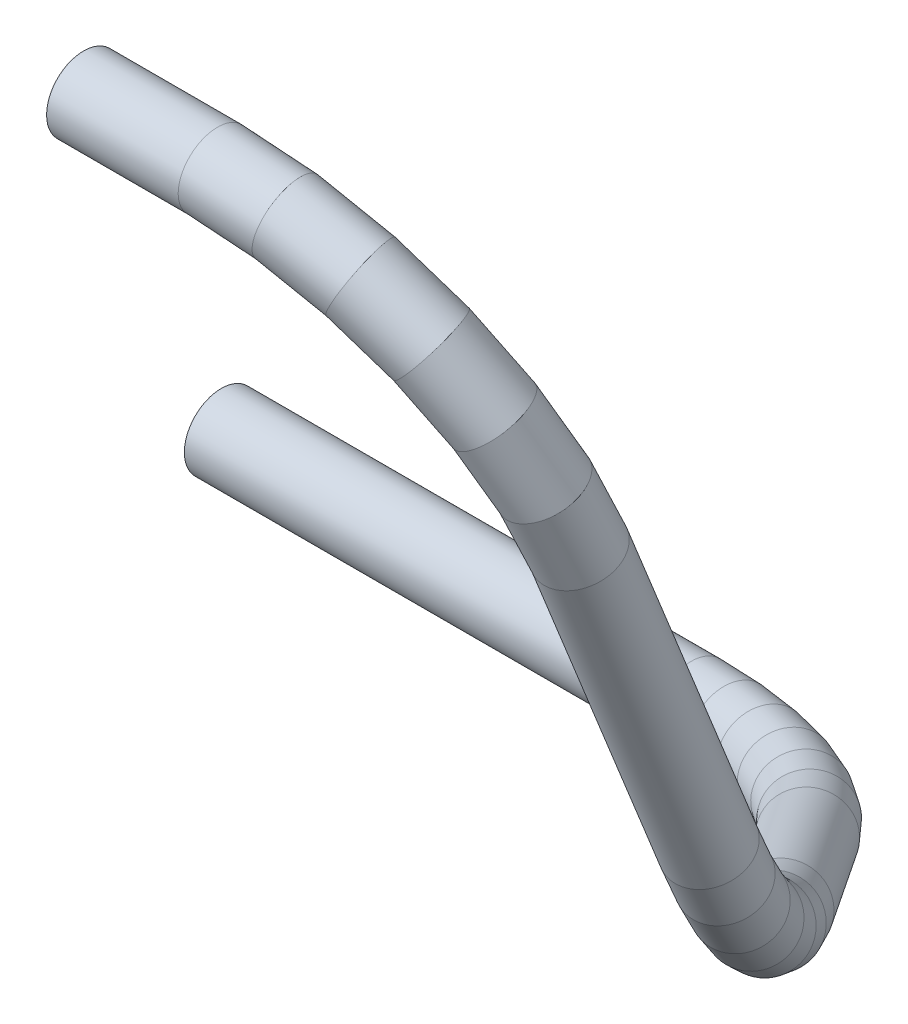
ISO-10303-21;
HEADER;
FILE_DESCRIPTION(('STEP AP214'),'2;1');
FILE_NAME('part.step','',(''),(''),'','','');
FILE_SCHEMA(('AUTOMOTIVE_DESIGN { 1 0 10303 214 1 1 1 1 }'));
ENDSEC;
DATA;
#1=APPLICATION_CONTEXT('core data for automotive mechanical design processes');
#2=APPLICATION_PROTOCOL_DEFINITION('international standard','automotive_design',2000,#1);
#3=PRODUCT_CONTEXT('',#1,'mechanical');
#4=PRODUCT('Part','Part','',(#3));
#5=PRODUCT_RELATED_PRODUCT_CATEGORY('part','',(#4));
#6=PRODUCT_DEFINITION_FORMATION('','',#4);
#7=PRODUCT_DEFINITION_CONTEXT('part definition',#1,'design');
#8=PRODUCT_DEFINITION('design','',#6,#7);
#9=PRODUCT_DEFINITION_SHAPE('','',#8);
#10=(LENGTH_UNIT() NAMED_UNIT(*) SI_UNIT(.MILLI.,.METRE.));
#11=(NAMED_UNIT(*) PLANE_ANGLE_UNIT() SI_UNIT($,.RADIAN.));
#12=(NAMED_UNIT(*) SI_UNIT($,.STERADIAN.) SOLID_ANGLE_UNIT());
#13=UNCERTAINTY_MEASURE_WITH_UNIT(LENGTH_MEASURE(1.E-05),#10,'distance_accuracy_value','');
#14=(GEOMETRIC_REPRESENTATION_CONTEXT(3) GLOBAL_UNCERTAINTY_ASSIGNED_CONTEXT((#13)) GLOBAL_UNIT_ASSIGNED_CONTEXT((#10,
#11,#12)) REPRESENTATION_CONTEXT('',''));
#15=CARTESIAN_POINT('',(0.,0.,0.));
#16=DIRECTION('',(0.,0.,1.));
#17=DIRECTION('',(1.,0.,0.));
#18=AXIS2_PLACEMENT_3D('',#15,#16,#17);
#19=CARTESIAN_POINT('',(-530.,11.7,-66.9));
#20=DIRECTION('',(-1.,0.,0.));
#21=DIRECTION('',(0.,0.,1.));
#22=AXIS2_PLACEMENT_3D('',#19,#20,#21);
#23=CYLINDRICAL_SURFACE('',#22,1.);
#24=CARTESIAN_POINT('',(-530.,11.7,-66.9));
#25=DIRECTION('',(-0.997858923238604,0.0606787237936054,0.0244061834762019));
#26=DIRECTION('',(0.0654031292301423,0.925778425297038,0.372366402809709));
#27=AXIS2_PLACEMENT_3D('',#24,#25,#26);
#28=ELLIPSE('',#27,1.0021456708073,1.);
#29=CARTESIAN_POINT('',(-529.934456537185,12.6277648410382,-66.5268346214702));
#30=VERTEX_POINT('',#29);
#31=EDGE_CURVE('E77',#30,#30,#28,.T.);
#32=ORIENTED_EDGE('',*,*,#31,.F.);
#33=EDGE_LOOP('',(#32));
#34=FACE_BOUND('',#33,.T.);
#35=CARTESIAN_POINT('',(-538.85,11.7,-66.9));
#36=DIRECTION('',(-1.,0.,0.));
#37=DIRECTION('',(0.,0.,1.));
#38=AXIS2_PLACEMENT_3D('',#35,#36,#37);
#39=CIRCLE('',#38,1.);
#40=CARTESIAN_POINT('',(-538.85,11.7,-65.9));
#41=VERTEX_POINT('',#40);
#42=EDGE_CURVE('E11',#41,#41,#39,.F.);
#43=ORIENTED_EDGE('',*,*,#42,.F.);
#44=EDGE_LOOP('',(#43));
#45=FACE_BOUND('',#44,.T.);
#46=ADVANCED_FACE('F58',(#34,#45),#23,.F.);
#47=CARTESIAN_POINT('',(-530.,11.7,-66.9));
#48=DIRECTION('',(-1.,0.,0.));
#49=DIRECTION('',(0.,0.,1.));
#50=AXIS2_PLACEMENT_3D('',#47,#48,#49);
#51=CYLINDRICAL_SURFACE('',#50,2.5);
#52=CARTESIAN_POINT('',(-530.,11.7,-66.9));
#53=DIRECTION('',(-0.997858923238604,0.0606787237936054,0.0244061834762019));
#54=DIRECTION('',(0.0654031292301423,0.925778425297038,0.372366402809709));
#55=AXIS2_PLACEMENT_3D('',#52,#53,#54);
#56=ELLIPSE('',#55,2.50536417701825,2.5);
#57=CARTESIAN_POINT('',(-529.836141342962,14.0194121025956,-65.9670865536754));
#58=VERTEX_POINT('',#57);
#59=EDGE_CURVE('E75',#58,#58,#56,.T.);
#60=ORIENTED_EDGE('',*,*,#59,.T.);
#61=EDGE_LOOP('',(#60));
#62=FACE_BOUND('',#61,.T.);
#63=CARTESIAN_POINT('',(-538.85,11.7,-66.9));
#64=DIRECTION('',(-1.,0.,0.));
#65=DIRECTION('',(0.,0.,1.));
#66=AXIS2_PLACEMENT_3D('',#63,#64,#65);
#67=CIRCLE('',#66,2.5);
#68=CARTESIAN_POINT('',(-538.85,11.7,-64.4));
#69=VERTEX_POINT('',#68);
#70=EDGE_CURVE('E61',#69,#69,#67,.F.);
#71=ORIENTED_EDGE('',*,*,#70,.T.);
#72=EDGE_LOOP('',(#71));
#73=FACE_BOUND('',#72,.T.);
#74=ADVANCED_FACE('F65',(#62,#73),#51,.T.);
#75=CARTESIAN_POINT('',(-525.341257188155,11.1309692335842,-67.1288754347568));
#76=DIRECTION('',(-0.991444861373811,0.12109761197636,0.0487078559278532));
#77=DIRECTION('',(-0.121241517415333,-0.992623037439101,0.));
#78=AXIS2_PLACEMENT_3D('',#75,#76,#77);
#79=CYLINDRICAL_SURFACE('',#78,2.5);
#80=CARTESIAN_POINT('',(-525.341257188155,11.1309692335842,-67.1288754347568));
#81=DIRECTION('',(-0.965925826289068,0.240123210237206,0.0965823069364155));
#82=DIRECTION('',(0.258819045102522,0.896152020681788,0.36045007659892));
#83=AXIS2_PLACEMENT_3D('',#80,#81,#82);
#84=ELLIPSE('',#83,2.52157240145038,2.5);
#85=CARTESIAN_POINT('',(-524.688626227054,13.3906814364394,-66.2199744695043));
#86=VERTEX_POINT('',#85);
#87=EDGE_CURVE('E78',#86,#86,#84,.F.);
#88=ORIENTED_EDGE('',*,*,#87,.F.);
#89=EDGE_LOOP('',(#88));
#90=FACE_BOUND('',#89,.T.);
#91=ORIENTED_EDGE('',*,*,#59,.F.);
#92=EDGE_LOOP('',(#91));
#93=FACE_BOUND('',#92,.T.);
#94=ADVANCED_FACE('F215',(#90,#93),#79,.T.);
#95=CARTESIAN_POINT('',(-525.341257188155,11.1309692335842,-67.1288754347568));
#96=DIRECTION('',(-0.991444861373811,0.12109761197636,0.0487078559278532));
#97=DIRECTION('',(-0.121241517415333,-0.992623037439101,0.));
#98=AXIS2_PLACEMENT_3D('',#95,#96,#97);
#99=CYLINDRICAL_SURFACE('',#98,1.);
#100=CARTESIAN_POINT('',(-525.341257188155,11.1309692335842,-67.1288754347568));
#101=DIRECTION('',(-0.965925826289068,0.240123210237206,0.0965823069364155));
#102=DIRECTION('',(0.258819045102522,0.896152020681788,0.36045007659892));
#103=AXIS2_PLACEMENT_3D('',#100,#101,#102);
#104=ELLIPSE('',#103,1.00862896058015,1.);
#105=CARTESIAN_POINT('',(-525.080204803715,12.0348541147263,-66.7653150486558));
#106=VERTEX_POINT('',#105);
#107=EDGE_CURVE('E80',#106,#106,#104,.F.);
#108=ORIENTED_EDGE('',*,*,#107,.T.);
#109=EDGE_LOOP('',(#108));
#110=FACE_BOUND('',#109,.T.);
#111=ORIENTED_EDGE('',*,*,#31,.T.);
#112=EDGE_LOOP('',(#111));
#113=FACE_BOUND('',#112,.T.);
#114=ADVANCED_FACE('F202',(#110,#113),#99,.F.);
#115=CARTESIAN_POINT('',(-521.,9.46265544070036,-67.7999042563829));
#116=DIRECTION('',(-0.923879532511285,0.355040233796162,0.142804207895621));
#117=DIRECTION('',(-0.358716736816524,-0.933446464842899,0.));
#118=AXIS2_PLACEMENT_3D('',#115,#116,#117);
#119=CYLINDRICAL_SURFACE('',#118,1.);
#120=CARTESIAN_POINT('',(-521.,9.46265544070036,-67.7999042563829));
#121=DIRECTION('',(-0.866025403784438,0.463882420519113,0.186582689264922));
#122=DIRECTION('',(0.500000000000002,0.803467921077137,0.323170697619667));
#123=AXIS2_PLACEMENT_3D('',#120,#121,#122);
#124=ELLIPSE('',#123,1.00862896058015,1.);
#125=CARTESIAN_POINT('',(-520.49568551971,10.2730564547959,-67.4739449315529));
#126=VERTEX_POINT('',#125);
#127=EDGE_CURVE('E81',#126,#126,#124,.T.);
#128=ORIENTED_EDGE('',*,*,#127,.F.);
#129=EDGE_LOOP('',(#128));
#130=FACE_BOUND('',#129,.T.);
#131=ORIENTED_EDGE('',*,*,#107,.F.);
#132=EDGE_LOOP('',(#131));
#133=FACE_BOUND('',#132,.T.);
#134=ADVANCED_FACE('F220',(#130,#133),#119,.F.);
#135=CARTESIAN_POINT('',(-521.,9.46265544070036,-67.7999042563829));
#136=DIRECTION('',(-0.923879532511285,0.355040233796162,0.142804207895621));
#137=DIRECTION('',(-0.358716736816524,-0.933446464842899,0.));
#138=AXIS2_PLACEMENT_3D('',#135,#136,#137);
#139=CYLINDRICAL_SURFACE('',#138,2.5);
#140=CARTESIAN_POINT('',(-521.,9.46265544070036,-67.7999042563829));
#141=DIRECTION('',(-0.866025403784438,0.463882420519113,0.186582689264922));
#142=DIRECTION('',(0.500000000000002,0.803467921077137,0.323170697619667));
#143=AXIS2_PLACEMENT_3D('',#140,#141,#142);
#144=ELLIPSE('',#143,2.52157240145038,2.5);
#145=CARTESIAN_POINT('',(-519.739213799275,11.4886579759392,-66.9850059443077));
#146=VERTEX_POINT('',#145);
#147=EDGE_CURVE('E82',#146,#146,#144,.T.);
#148=ORIENTED_EDGE('',*,*,#147,.T.);
#149=EDGE_LOOP('',(#148));
#150=FACE_BOUND('',#149,.T.);
#151=ORIENTED_EDGE('',*,*,#87,.T.);
#152=EDGE_LOOP('',(#151));
#153=FACE_BOUND('',#152,.T.);
#154=ADVANCED_FACE('F225',(#150,#153),#139,.T.);
#155=CARTESIAN_POINT('',(-517.272077938642,6.80875144931453,-68.8673569596122));
#156=DIRECTION('',(-0.793353340291235,0.564787450414478,0.227168689090405));
#157=DIRECTION('',(-0.579949997240358,-0.814652073403676,0.));
#158=AXIS2_PLACEMENT_3D('',#155,#156,#157);
#159=CYLINDRICAL_SURFACE('',#158,2.5);
#160=CARTESIAN_POINT('',(-517.272077938642,6.80875144931453,-68.8673569596122));
#161=DIRECTION('',(-0.707106781186552,0.656028810444585,0.263867769662492));
#162=DIRECTION('',(0.707106781186544,0.656028810444596,0.263867769662485));
#163=AXIS2_PLACEMENT_3D('',#160,#161,#162);
#164=ELLIPSE('',#163,2.52157240145038,2.5);
#165=CARTESIAN_POINT('',(-515.489056994324,8.46297559228795,-68.201995273999));
#166=VERTEX_POINT('',#165);
#167=EDGE_CURVE('E86',#166,#166,#164,.F.);
#168=ORIENTED_EDGE('',*,*,#167,.F.);
#169=EDGE_LOOP('',(#168));
#170=FACE_BOUND('',#169,.T.);
#171=ORIENTED_EDGE('',*,*,#147,.F.);
#172=EDGE_LOOP('',(#171));
#173=FACE_BOUND('',#172,.T.);
#174=ADVANCED_FACE('F223',(#170,#173),#159,.T.);
#175=CARTESIAN_POINT('',(-517.272077938642,6.80875144931453,-68.8673569596122));
#176=DIRECTION('',(-0.793353340291235,0.564787450414478,0.227168689090405));
#177=DIRECTION('',(-0.579949997240358,-0.814652073403676,0.));
#178=AXIS2_PLACEMENT_3D('',#175,#176,#177);
#179=CYLINDRICAL_SURFACE('',#178,1.);
#180=CARTESIAN_POINT('',(-517.272077938642,6.80875144931453,-68.8673569596122));
#181=DIRECTION('',(-0.707106781186552,0.656028810444585,0.263867769662492));
#182=DIRECTION('',(0.707106781186544,0.656028810444596,0.263867769662485));
#183=AXIS2_PLACEMENT_3D('',#180,#181,#182);
#184=ELLIPSE('',#183,1.00862896058015,1.);
#185=CARTESIAN_POINT('',(-516.558869560915,7.4704411065039,-68.601212285367));
#186=VERTEX_POINT('',#185);
#187=EDGE_CURVE('E83',#186,#186,#184,.F.);
#188=ORIENTED_EDGE('',*,*,#187,.T.);
#189=EDGE_LOOP('',(#188));
#190=FACE_BOUND('',#189,.T.);
#191=ORIENTED_EDGE('',*,*,#127,.T.);
#192=EDGE_LOOP('',(#191));
#193=FACE_BOUND('',#192,.T.);
#194=ADVANCED_FACE('F228',(#190,#193),#179,.F.);
#195=CARTESIAN_POINT('',(-514.41154273188,3.35011643065596,-70.2584884067686));
#196=DIRECTION('',(-0.60876142900873,0.736045335642437,0.296051999537686));
#197=DIRECTION('',(-0.770589455284477,-0.637331853436162,0.));
#198=AXIS2_PLACEMENT_3D('',#195,#196,#197);
#199=CYLINDRICAL_SURFACE('',#198,1.);
#200=CARTESIAN_POINT('',(-514.41154273188,3.35011643065596,-70.2584884067686));
#201=DIRECTION('',(-0.500000000000003,0.803467921077132,0.323170697619676));
#202=DIRECTION('',(0.866025403784437,0.463882420519107,0.186582689264939));
#203=AXIS2_PLACEMENT_3D('',#200,#201,#202);
#204=ELLIPSE('',#203,1.00862896058015,1.);
#205=CARTESIAN_POINT('',(-513.538044429025,3.81800167429556,-70.070295702833));
#206=VERTEX_POINT('',#205);
#207=EDGE_CURVE('E95',#206,#206,#204,.T.);
#208=ORIENTED_EDGE('',*,*,#207,.F.);
#209=EDGE_LOOP('',(#208));
#210=FACE_BOUND('',#209,.T.);
#211=ORIENTED_EDGE('',*,*,#187,.F.);
#212=EDGE_LOOP('',(#211));
#213=FACE_BOUND('',#212,.T.);
#214=ADVANCED_FACE('F234',(#210,#213),#199,.F.);
#215=CARTESIAN_POINT('',(-514.41154273188,3.35011643065596,-70.2584884067686));
#216=DIRECTION('',(-0.60876142900873,0.736045335642437,0.296051999537686));
#217=DIRECTION('',(-0.770589455284477,-0.637331853436162,0.));
#218=AXIS2_PLACEMENT_3D('',#215,#216,#217);
#219=CYLINDRICAL_SURFACE('',#218,2.5);
#220=CARTESIAN_POINT('',(-514.41154273188,3.35011643065596,-70.2584884067686));
#221=DIRECTION('',(-0.500000000000003,0.803467921077132,0.323170697619676));
#222=DIRECTION('',(0.866025403784437,0.463882420519107,0.186582689264939));
#223=AXIS2_PLACEMENT_3D('',#220,#221,#222);
#224=ELLIPSE('',#223,2.52157240145039,2.5);
#225=CARTESIAN_POINT('',(-512.227796974742,4.51982953975495,-69.7880066469297));
#226=VERTEX_POINT('',#225);
#227=EDGE_CURVE('E90',#226,#226,#224,.T.);
#228=ORIENTED_EDGE('',*,*,#227,.T.);
#229=EDGE_LOOP('',(#228));
#230=FACE_BOUND('',#229,.T.);
#231=ORIENTED_EDGE('',*,*,#167,.T.);
#232=EDGE_LOOP('',(#231));
#233=FACE_BOUND('',#232,.T.);
#234=ADVANCED_FACE('F236',(#230,#233),#219,.T.);
#235=CARTESIAN_POINT('',(-512.613335126797,-0.677549354418361,-71.8784952886817));
#236=DIRECTION('',(-0.382683432365086,0.857142947618804,0.344759855465548));
#237=DIRECTION('',(-0.913125854266893,-0.407677782408309,0.));
#238=AXIS2_PLACEMENT_3D('',#235,#236,#237);
#239=CYLINDRICAL_SURFACE('',#238,2.5);
#240=CARTESIAN_POINT('',(-512.613335126797,-0.677549354418361,-71.8784952886817));
#241=DIRECTION('',(-0.258819045102515,0.896152020681794,0.36045007659891));
#242=DIRECTION('',(0.96592582628907,0.240123210237202,0.0965823069364053));
#243=AXIS2_PLACEMENT_3D('',#240,#241,#242);
#244=ELLIPSE('',#243,2.52157240145038,2.5);
#245=CARTESIAN_POINT('',(-510.177683221378,-0.0720612945365645,-71.6349560090424));
#246=VERTEX_POINT('',#245);
#247=EDGE_CURVE('E96',#246,#246,#244,.F.);
#248=ORIENTED_EDGE('',*,*,#247,.F.);
#249=EDGE_LOOP('',(#248));
#250=FACE_BOUND('',#249,.T.);
#251=ORIENTED_EDGE('',*,*,#227,.F.);
#252=EDGE_LOOP('',(#251));
#253=FACE_BOUND('',#252,.T.);
#254=ADVANCED_FACE('F242',(#250,#253),#239,.T.);
#255=CARTESIAN_POINT('',(-512.613335126797,-0.677549354418361,-71.8784952886817));
#256=DIRECTION('',(-0.382683432365086,0.857142947618804,0.344759855465548));
#257=DIRECTION('',(-0.913125854266893,-0.407677782408309,0.));
#258=AXIS2_PLACEMENT_3D('',#255,#256,#257);
#259=CYLINDRICAL_SURFACE('',#258,1.);
#260=CARTESIAN_POINT('',(-512.613335126797,-0.677549354418361,-71.8784952886817));
#261=DIRECTION('',(-0.258819045102515,0.896152020681794,0.36045007659891));
#262=DIRECTION('',(0.96592582628907,0.240123210237202,0.0965823069364053));
#263=AXIS2_PLACEMENT_3D('',#260,#261,#262);
#264=ELLIPSE('',#263,1.00862896058015,1.);
#265=CARTESIAN_POINT('',(-511.639074364629,-0.435354130465643,-71.781079576826));
#266=VERTEX_POINT('',#265);
#267=EDGE_CURVE('E91',#266,#266,#264,.F.);
#268=ORIENTED_EDGE('',*,*,#267,.T.);
#269=EDGE_LOOP('',(#268));
#270=FACE_BOUND('',#269,.T.);
#271=ORIENTED_EDGE('',*,*,#207,.T.);
#272=EDGE_LOOP('',(#271));
#273=FACE_BOUND('',#272,.T.);
#274=ADVANCED_FACE('F247',(#270,#273),#259,.F.);
#275=CARTESIAN_POINT('',(-512.,-4.99976713868806,-73.6169768135371));
#276=DIRECTION('',(-0.130526192220043,0.919827684210638,0.369972896986023));
#277=DIRECTION('',(0.,-0.37316537852984,0.927764841038224));
#278=AXIS2_PLACEMENT_3D('',#275,#276,#277);
#279=CYLINDRICAL_SURFACE('',#278,1.);
#280=CARTESIAN_POINT('',(-512.,-4.99976713868806,-73.6169768135371));
#281=DIRECTION('',(-0.065403129230139,0.925778425297037,0.372366402809712));
#282=DIRECTION('',(0.997858923238604,0.0606787237936065,0.0244061834761906));
#283=AXIS2_PLACEMENT_3D('',#280,#281,#282);
#284=ELLIPSE('',#283,1.0021456708073,1.);
#285=CARTESIAN_POINT('',(-511.,-4.93895821832818,-73.5925182624255));
#286=VERTEX_POINT('',#285);
#287=EDGE_CURVE('E99',#286,#286,#284,.T.);
#288=ORIENTED_EDGE('',*,*,#287,.F.);
#289=EDGE_LOOP('',(#288));
#290=FACE_BOUND('',#289,.T.);
#291=ORIENTED_EDGE('',*,*,#267,.F.);
#292=EDGE_LOOP('',(#291));
#293=FACE_BOUND('',#292,.T.);
#294=ADVANCED_FACE('F246',(#290,#293),#279,.F.);
#295=CARTESIAN_POINT('',(-512.,-4.99976713868806,-73.6169768135371));
#296=DIRECTION('',(-0.130526192220043,0.919827684210638,0.369972896986023));
#297=DIRECTION('',(0.,-0.37316537852984,0.927764841038224));
#298=AXIS2_PLACEMENT_3D('',#295,#296,#297);
#299=CYLINDRICAL_SURFACE('',#298,2.5);
#300=CARTESIAN_POINT('',(-512.,-4.99976713868806,-73.6169768135371));
#301=DIRECTION('',(-0.065403129230139,0.925778425297037,0.372366402809712));
#302=DIRECTION('',(0.997858923238604,0.0606787237936065,0.0244061834761906));
#303=AXIS2_PLACEMENT_3D('',#300,#301,#302);
#304=ELLIPSE('',#303,2.50536417701825,2.5);
#305=CARTESIAN_POINT('',(-509.5,-4.84774483778837,-73.5558304357582));
#306=VERTEX_POINT('',#305);
#307=EDGE_CURVE('E100',#306,#306,#304,.T.);
#308=ORIENTED_EDGE('',*,*,#307,.T.);
#309=EDGE_LOOP('',(#308));
#310=FACE_BOUND('',#309,.T.);
#311=ORIENTED_EDGE('',*,*,#247,.T.);
#312=EDGE_LOOP('',(#311));
#313=FACE_BOUND('',#312,.T.);
#314=ADVANCED_FACE('F255',(#310,#313),#299,.T.);
#315=CARTESIAN_POINT('',(-512.,-26.7506677137951,-82.3656194516777));
#316=DIRECTION('',(0.,0.927764841038225,0.373165378529839));
#317=DIRECTION('',(0.,-0.373165378529839,0.927764841038225));
#318=AXIS2_PLACEMENT_3D('',#315,#316,#317);
#319=CYLINDRICAL_SURFACE('',#318,2.5);
#320=CARTESIAN_POINT('',(-512.,-26.7506677137951,-82.3656194516777));
#321=DIRECTION('',(0.0291925180335751,0.91649620306068,0.398976824723212));
#322=DIRECTION('',(0.719226347583992,-0.29645007426823,0.62835564325257));
#323=AXIS2_PLACEMENT_3D('',#320,#321,#322);
#324=ELLIPSE('',#323,2.50205846359654,2.5);
#325=CARTESIAN_POINT('',(-510.200453629786,-27.4924031311517,-80.793436896329));
#326=VERTEX_POINT('',#325);
#327=EDGE_CURVE('E102',#326,#326,#324,.F.);
#328=ORIENTED_EDGE('',*,*,#327,.F.);
#329=EDGE_LOOP('',(#328));
#330=FACE_BOUND('',#329,.T.);
#331=ORIENTED_EDGE('',*,*,#307,.F.);
#332=EDGE_LOOP('',(#331));
#333=FACE_BOUND('',#332,.T.);
#334=ADVANCED_FACE('F260',(#330,#333),#319,.T.);
#335=CARTESIAN_POINT('',(-512.,-26.7506677137951,-82.3656194516777));
#336=DIRECTION('',(0.,0.927764841038225,0.373165378529839));
#337=DIRECTION('',(0.,-0.373165378529839,0.927764841038225));
#338=AXIS2_PLACEMENT_3D('',#335,#336,#337);
#339=CYLINDRICAL_SURFACE('',#338,1.);
#340=CARTESIAN_POINT('',(-512.,-26.7506677137951,-82.3656194516777));
#341=DIRECTION('',(0.0291925180335751,0.91649620306068,0.398976824723212));
#342=DIRECTION('',(0.719226347583992,-0.29645007426823,0.62835564325257));
#343=AXIS2_PLACEMENT_3D('',#340,#341,#342);
#344=ELLIPSE('',#343,1.00082338543862,1.);
#345=CARTESIAN_POINT('',(-511.280181451914,-27.0473618807378,-81.7367464295382));
#346=VERTEX_POINT('',#345);
#347=EDGE_CURVE('E101',#346,#346,#344,.F.);
#348=ORIENTED_EDGE('',*,*,#347,.T.);
#349=EDGE_LOOP('',(#348));
#350=FACE_BOUND('',#349,.T.);
#351=ORIENTED_EDGE('',*,*,#287,.T.);
#352=EDGE_LOOP('',(#351));
#353=FACE_BOUND('',#352,.T.);
#354=ADVANCED_FACE('F265',(#350,#353),#339,.F.);
#355=CARTESIAN_POINT('',(-512.170203185472,-29.387346663385,-83.6030601604251));
#356=DIRECTION('',(0.0583370022289824,0.903719547506555,0.424131788039382));
#357=DIRECTION('',(0.,-0.424855339245964,0.90526125550263));
#358=AXIS2_PLACEMENT_3D('',#355,#356,#357);
#359=CYLINDRICAL_SURFACE('',#358,1.);
#360=CARTESIAN_POINT('',(-512.170203185472,-29.387346663385,-83.6030601604251));
#361=DIRECTION('',(0.116290207836512,0.873728722050721,0.472307852808901));
#362=DIRECTION('',(0.710362815559671,-0.405519490310675,0.575272642534223));
#363=AXIS2_PLACEMENT_3D('',#360,#361,#362);
#364=ELLIPSE('',#363,1.00330033481439,1.);
#365=CARTESIAN_POINT('',(-511.457495934782,-29.7942045037875,-83.0258889255609));
#366=VERTEX_POINT('',#365);
#367=EDGE_CURVE('E107',#366,#366,#364,.T.);
#368=ORIENTED_EDGE('',*,*,#367,.F.);
#369=EDGE_LOOP('',(#368));
#370=FACE_BOUND('',#369,.T.);
#371=ORIENTED_EDGE('',*,*,#347,.F.);
#372=EDGE_LOOP('',(#371));
#373=FACE_BOUND('',#372,.T.);
#374=ADVANCED_FACE('F264',(#370,#373),#359,.F.);
#375=CARTESIAN_POINT('',(-512.170203185472,-29.387346663385,-83.6030601604251));
#376=DIRECTION('',(0.0583370022289824,0.903719547506555,0.424131788039382));
#377=DIRECTION('',(0.,-0.424855339245964,0.90526125550263));
#378=AXIS2_PLACEMENT_3D('',#375,#376,#377);
#379=CYLINDRICAL_SURFACE('',#378,2.5);
#380=CARTESIAN_POINT('',(-512.170203185472,-29.387346663385,-83.6030601604251));
#381=DIRECTION('',(0.116290207836512,0.873728722050721,0.472307852808901));
#382=DIRECTION('',(0.710362815559671,-0.405519490310675,0.575272642534223));
#383=AXIS2_PLACEMENT_3D('',#380,#381,#382);
#384=ELLIPSE('',#383,2.50825083703598,2.5);
#385=CARTESIAN_POINT('',(-510.388435058746,-30.4044912643912,-82.1601320732647));
#386=VERTEX_POINT('',#385);
#387=EDGE_CURVE('E104',#386,#386,#384,.T.);
#388=ORIENTED_EDGE('',*,*,#387,.T.);
#389=EDGE_LOOP('',(#388));
#390=FACE_BOUND('',#389,.T.);
#391=ORIENTED_EDGE('',*,*,#327,.T.);
#392=EDGE_LOOP('',(#391));
#393=FACE_BOUND('',#392,.T.);
#394=ADVANCED_FACE('F269',(#390,#393),#379,.T.);
#395=CARTESIAN_POINT('',(-512.676341071075,-31.8322530913981,-85.1125506420907));
#396=DIRECTION('',(0.173478345182469,0.837989673017844,0.51737662458619));
#397=DIRECTION('',(0.,-0.525342026418493,0.850891153602217));
#398=AXIS2_PLACEMENT_3D('',#395,#396,#397);
#399=CYLINDRICAL_SURFACE('',#398,2.5);
#400=CARTESIAN_POINT('',(-512.676341071075,-31.8322530913981,-85.1125506420907));
#401=DIRECTION('',(0.229525175977841,0.796737526070035,0.559041597865617));
#402=DIRECTION('',(0.682244044137142,-0.541347625200374,0.491412060219641));
#403=AXIS2_PLACEMENT_3D('',#400,#401,#402);
#404=ELLIPSE('',#403,2.50825083703598,2.5);
#405=CARTESIAN_POINT('',(-510.965101876305,-33.1900887254344,-83.8799659307152));
#406=VERTEX_POINT('',#405);
#407=EDGE_CURVE('E115',#406,#406,#404,.F.);
#408=ORIENTED_EDGE('',*,*,#407,.F.);
#409=EDGE_LOOP('',(#408));
#410=FACE_BOUND('',#409,.T.);
#411=ORIENTED_EDGE('',*,*,#387,.F.);
#412=EDGE_LOOP('',(#411));
#413=FACE_BOUND('',#412,.T.);
#414=ADVANCED_FACE('F272',(#410,#413),#399,.T.);
#415=CARTESIAN_POINT('',(-512.676341071075,-31.8322530913981,-85.1125506420907));
#416=DIRECTION('',(0.173478345182469,0.837989673017844,0.51737662458619));
#417=DIRECTION('',(0.,-0.525342026418493,0.850891153602217));
#418=AXIS2_PLACEMENT_3D('',#415,#416,#417);
#419=CYLINDRICAL_SURFACE('',#418,1.);
#420=CARTESIAN_POINT('',(-512.676341071075,-31.8322530913981,-85.1125506420907));
#421=DIRECTION('',(0.229525175977841,0.796737526070035,0.559041597865617));
#422=DIRECTION('',(0.682244044137142,-0.541347625200374,0.491412060219641));
#423=AXIS2_PLACEMENT_3D('',#420,#421,#422);
#424=ELLIPSE('',#423,1.00330033481439,1.);
#425=CARTESIAN_POINT('',(-511.991845393167,-32.3753873450127,-84.6195167575405));
#426=VERTEX_POINT('',#425);
#427=EDGE_CURVE('E108',#426,#426,#424,.F.);
#428=ORIENTED_EDGE('',*,*,#427,.T.);
#429=EDGE_LOOP('',(#428));
#430=FACE_BOUND('',#429,.T.);
#431=ORIENTED_EDGE('',*,*,#367,.T.);
#432=EDGE_LOOP('',(#431));
#433=FACE_BOUND('',#432,.T.);
#434=ADVANCED_FACE('F279',(#430,#433),#419,.F.);
#435=CARTESIAN_POINT('',(-513.505116126532,-34.0211530841726,-86.8544327403697));
#436=DIRECTION('',(0.284061970540246,0.750243677302788,0.597028660585053));
#437=DIRECTION('',(0.,-0.62267936254504,0.782477099639665));
#438=AXIS2_PLACEMENT_3D('',#435,#436,#437);
#439=CYLINDRICAL_SURFACE('',#438,1.);
#440=CARTESIAN_POINT('',(-513.505116126532,-34.0211530841726,-86.8544327403697));
#441=DIRECTION('',(0.336729933650505,0.698814007741792,0.631087897497315));
#442=DIRECTION('',(0.636200985500548,-0.662953180354527,0.394640832537574));
#443=AXIS2_PLACEMENT_3D('',#440,#441,#442);
#444=ELLIPSE('',#443,1.00330033481439,1.);
#445=CARTESIAN_POINT('',(-512.86681546477,-34.6862942319885,-86.4584894609533));
#446=VERTEX_POINT('',#445);
#447=EDGE_CURVE('E117',#446,#446,#444,.T.);
#448=ORIENTED_EDGE('',*,*,#447,.F.);
#449=EDGE_LOOP('',(#448));
#450=FACE_BOUND('',#449,.T.);
#451=ORIENTED_EDGE('',*,*,#427,.F.);
#452=EDGE_LOOP('',(#451));
#453=FACE_BOUND('',#452,.T.);
#454=ADVANCED_FACE('F282',(#450,#453),#439,.F.);
#455=CARTESIAN_POINT('',(-513.505116126532,-34.0211530841726,-86.8544327403697));
#456=DIRECTION('',(0.284061970540246,0.750243677302788,0.597028660585053));
#457=DIRECTION('',(0.,-0.62267936254504,0.782477099639665));
#458=AXIS2_PLACEMENT_3D('',#455,#456,#457);
#459=CYLINDRICAL_SURFACE('',#458,2.5);
#460=CARTESIAN_POINT('',(-513.505116126532,-34.0211530841726,-86.8544327403697));
#461=DIRECTION('',(0.336729933650505,0.698814007741792,0.631087897497315));
#462=DIRECTION('',(0.636200985500548,-0.662953180354527,0.394640832537574));
#463=AXIS2_PLACEMENT_3D('',#460,#461,#462);
#464=ELLIPSE('',#463,2.50825083703597,2.5);
#465=CARTESIAN_POINT('',(-511.909364472127,-35.6840059537125,-85.8645745418287));
#466=VERTEX_POINT('',#465);
#467=EDGE_CURVE('E114',#466,#466,#464,.T.);
#468=ORIENTED_EDGE('',*,*,#467,.T.);
#469=EDGE_LOOP('',(#468));
#470=FACE_BOUND('',#469,.T.);
#471=ORIENTED_EDGE('',*,*,#407,.T.);
#472=EDGE_LOOP('',(#471));
#473=FACE_BOUND('',#472,.T.);
#474=ADVANCED_FACE('F287',(#470,#473),#459,.T.);
#475=CARTESIAN_POINT('',(-514.63475432207,-35.8965386685852,-88.7829427797986));
#476=DIRECTION('',(0.387182565050984,0.642786870964841,0.660995234351784));
#477=DIRECTION('',(0.,-0.7169121836676,0.697163482196933));
#478=AXIS2_PLACEMENT_3D('',#475,#476,#477);
#479=CYLINDRICAL_SURFACE('',#478,2.5);
#480=CARTESIAN_POINT('',(-514.63475432207,-35.8965386685852,-88.7829427797986));
#481=DIRECTION('',(0.435087939055848,0.582530867088233,0.686553912069232));
#482=DIRECTION('',(0.573443307970931,-0.767141268377337,0.287501385902339));
#483=AXIS2_PLACEMENT_3D('',#480,#481,#482);
#484=ELLIPSE('',#483,2.50825083703598,2.5);
#485=CARTESIAN_POINT('',(-513.19641466486,-37.8207213971175,-88.0618171879601));
#486=VERTEX_POINT('',#485);
#487=EDGE_CURVE('E118',#486,#486,#484,.F.);
#488=ORIENTED_EDGE('',*,*,#487,.F.);
#489=EDGE_LOOP('',(#488));
#490=FACE_BOUND('',#489,.T.);
#491=ORIENTED_EDGE('',*,*,#467,.F.);
#492=EDGE_LOOP('',(#491));
#493=FACE_BOUND('',#492,.T.);
#494=ADVANCED_FACE('F286',(#490,#493),#479,.T.);
#495=CARTESIAN_POINT('',(-514.63475432207,-35.8965386685852,-88.7829427797986));
#496=DIRECTION('',(0.387182565050984,0.642786870964841,0.660995234351784));
#497=DIRECTION('',(0.,-0.7169121836676,0.697163482196933));
#498=AXIS2_PLACEMENT_3D('',#495,#496,#497);
#499=CYLINDRICAL_SURFACE('',#498,1.);
#500=CARTESIAN_POINT('',(-514.63475432207,-35.8965386685852,-88.7829427797986));
#501=DIRECTION('',(0.435087939055848,0.582530867088233,0.686553912069232));
#502=DIRECTION('',(0.573443307970931,-0.767141268377337,0.287501385902339));
#503=AXIS2_PLACEMENT_3D('',#500,#501,#502);
#504=ELLIPSE('',#503,1.00330033481439,1.);
#505=CARTESIAN_POINT('',(-514.059418459186,-36.6662117599981,-88.4944925430632));
#506=VERTEX_POINT('',#505);
#507=EDGE_CURVE('E120',#506,#506,#504,.F.);
#508=ORIENTED_EDGE('',*,*,#507,.T.);
#509=EDGE_LOOP('',(#508));
#510=FACE_BOUND('',#509,.T.);
#511=ORIENTED_EDGE('',*,*,#447,.T.);
#512=EDGE_LOOP('',(#511));
#513=FACE_BOUND('',#512,.T.);
#514=ADVANCED_FACE('F294',(#510,#513),#499,.F.);
#515=CARTESIAN_POINT('',(-516.03557718759,-37.4091386928523,-90.8474138939692));
#516=DIRECTION('',(0.480130888275706,0.518442417762547,0.707595781211354));
#517=DIRECTION('',(0.,-0.806655625401417,0.59102174410782));
#518=AXIS2_PLACEMENT_3D('',#515,#516,#517);
#519=CYLINDRICAL_SURFACE('',#518,1.);
#520=CARTESIAN_POINT('',(-516.03557718759,-37.4091386928523,-90.8474138939692));
#521=DIRECTION('',(0.522015077090389,0.450943158131672,0.723982408228646));
#522=DIRECTION('',(0.495619815441823,-0.851174603058933,0.172808546226399));
#523=AXIS2_PLACEMENT_3D('',#520,#521,#522);
#524=ELLIPSE('',#523,1.00330033481439,1.);
#525=CARTESIAN_POINT('',(-515.538321660817,-38.2631224570868,-90.6740350216815));
#526=VERTEX_POINT('',#525);
#527=EDGE_CURVE('E121',#526,#526,#524,.T.);
#528=ORIENTED_EDGE('',*,*,#527,.F.);
#529=EDGE_LOOP('',(#528));
#530=FACE_BOUND('',#529,.T.);
#531=ORIENTED_EDGE('',*,*,#507,.F.);
#532=EDGE_LOOP('',(#531));
#533=FACE_BOUND('',#532,.T.);
#534=ADVANCED_FACE('F300',(#530,#533),#519,.F.);
#535=CARTESIAN_POINT('',(-516.03557718759,-37.4091386928523,-90.8474138939692));
#536=DIRECTION('',(0.480130888275706,0.518442417762547,0.707595781211354));
#537=DIRECTION('',(0.,-0.806655625401417,0.59102174410782));
#538=AXIS2_PLACEMENT_3D('',#535,#536,#537);
#539=CYLINDRICAL_SURFACE('',#538,2.5);
#540=CARTESIAN_POINT('',(-516.03557718759,-37.4091386928523,-90.8474138939692));
#541=DIRECTION('',(0.522015077090389,0.450943158131672,0.723982408228646));
#542=DIRECTION('',(0.495619815441823,-0.851174603058933,0.172808546226399));
#543=AXIS2_PLACEMENT_3D('',#540,#541,#542);
#544=ELLIPSE('',#543,2.50825083703598,2.5);
#545=CARTESIAN_POINT('',(-514.792438370657,-39.5440981034386,-90.4139667132499));
#546=VERTEX_POINT('',#545);
#547=EDGE_CURVE('E122',#546,#546,#544,.T.);
#548=ORIENTED_EDGE('',*,*,#547,.T.);
#549=EDGE_LOOP('',(#548));
#550=FACE_BOUND('',#549,.T.);
#551=ORIENTED_EDGE('',*,*,#487,.T.);
#552=EDGE_LOOP('',(#551));
#553=FACE_BOUND('',#552,.T.);
#554=ADVANCED_FACE('F305',(#550,#553),#539,.T.);
#555=CARTESIAN_POINT('',(-517.6707815416,-38.5192133050716,-92.993607173046));
#556=DIRECTION('',(0.560464951228248,0.380477162913355,0.735605986208733));
#557=DIRECTION('',(0.79543002722912,0.,-0.606045437060854));
#558=AXIS2_PLACEMENT_3D('',#555,#556,#557);
#559=CYLINDRICAL_SURFACE('',#558,2.5);
#560=CARTESIAN_POINT('',(-517.6707815416,-38.5192133050716,-92.993607173046));
#561=DIRECTION('',(0.57832204111576,0.344275832374886,0.73960649537594));
#562=DIRECTION('',(0.428581799576136,-0.899623303389212,0.0836394229485304));
#563=AXIS2_PLACEMENT_3D('',#560,#561,#562);
#564=ELLIPSE('',#563,2.50205846359654,2.5);
#565=CARTESIAN_POINT('',(-516.598444822627,-40.7701234053652,-92.7843364469673));
#566=VERTEX_POINT('',#565);
#567=EDGE_CURVE('E126',#566,#566,#564,.F.);
#568=ORIENTED_EDGE('',*,*,#567,.F.);
#569=EDGE_LOOP('',(#568));
#570=FACE_BOUND('',#569,.T.);
#571=ORIENTED_EDGE('',*,*,#547,.F.);
#572=EDGE_LOOP('',(#571));
#573=FACE_BOUND('',#572,.T.);
#574=ADVANCED_FACE('F303',(#570,#573),#559,.T.);
#575=CARTESIAN_POINT('',(-517.6707815416,-38.5192133050716,-92.993607173046));
#576=DIRECTION('',(0.560464951228248,0.380477162913355,0.735605986208733));
#577=DIRECTION('',(0.79543002722912,0.,-0.606045437060854));
#578=AXIS2_PLACEMENT_3D('',#575,#576,#577);
#579=CYLINDRICAL_SURFACE('',#578,1.);
#580=CARTESIAN_POINT('',(-517.6707815416,-38.5192133050716,-92.993607173046));
#581=DIRECTION('',(0.57832204111576,0.344275832374886,0.73960649537594));
#582=DIRECTION('',(0.428581799576136,-0.899623303389212,0.0836394229485304));
#583=AXIS2_PLACEMENT_3D('',#580,#581,#582);
#584=ELLIPSE('',#583,1.00082338543862,1.);
#585=CARTESIAN_POINT('',(-517.241846854011,-39.419577345189,-92.9098988826146));
#586=VERTEX_POINT('',#585);
#587=EDGE_CURVE('E123',#586,#586,#584,.F.);
#588=ORIENTED_EDGE('',*,*,#587,.T.);
#589=EDGE_LOOP('',(#588));
#590=FACE_BOUND('',#589,.T.);
#591=ORIENTED_EDGE('',*,*,#527,.T.);
#592=EDGE_LOOP('',(#591));
#593=FACE_BOUND('',#592,.T.);
#594=ADVANCED_FACE('F309',(#590,#593),#579,.F.);
#595=CARTESIAN_POINT('',(-524.603034008343,-42.1005718318644,-101.63977150015));
#596=DIRECTION('',(0.595227550625729,0.307508024850827,0.742390044133432));
#597=DIRECTION('',(0.780193962284359,0.,-0.625537673697621));
#598=AXIS2_PLACEMENT_3D('',#595,#596,#597);
#599=CYLINDRICAL_SURFACE('',#598,1.);
#600=CARTESIAN_POINT('',(-524.603034008343,-42.1005718318644,-101.63977150015));
#601=DIRECTION('',(0.626016294814627,0.298420358197777,0.72045047604931));
#602=DIRECTION('',(0.779809975972715,-0.239566064416136,-0.578363641797786));
#603=AXIS2_PLACEMENT_3D('',#600,#601,#602);
#604=ELLIPSE('',#603,1.00075651042622,1.);
#605=CARTESIAN_POINT('',(-523.822634097993,-42.340319130506,-102.218572680073));
#606=VERTEX_POINT('',#605);
#607=EDGE_CURVE('E135',#606,#606,#604,.T.);
#608=ORIENTED_EDGE('',*,*,#607,.F.);
#609=EDGE_LOOP('',(#608));
#610=FACE_BOUND('',#609,.T.);
#611=ORIENTED_EDGE('',*,*,#587,.F.);
#612=EDGE_LOOP('',(#611));
#613=FACE_BOUND('',#612,.T.);
#614=ADVANCED_FACE('F311',(#610,#613),#599,.F.);
#615=CARTESIAN_POINT('',(-524.603034008343,-42.1005718318644,-101.63977150015));
#616=DIRECTION('',(0.595227550625729,0.307508024850827,0.742390044133432));
#617=DIRECTION('',(0.780193962284359,0.,-0.625537673697621));
#618=AXIS2_PLACEMENT_3D('',#615,#616,#617);
#619=CYLINDRICAL_SURFACE('',#618,2.5);
#620=CARTESIAN_POINT('',(-524.603034008343,-42.1005718318644,-101.63977150015));
#621=DIRECTION('',(0.626016294814627,0.298420358197777,0.72045047604931));
#622=DIRECTION('',(0.779809975972715,-0.239566064416136,-0.578363641797786));
#623=AXIS2_PLACEMENT_3D('',#620,#621,#622);
#624=ELLIPSE('',#623,2.50189127606555,2.5);
#625=CARTESIAN_POINT('',(-522.652034232468,-42.6999400784685,-103.086774449957));
#626=VERTEX_POINT('',#625);
#627=EDGE_CURVE('E129',#626,#626,#624,.T.);
#628=ORIENTED_EDGE('',*,*,#627,.T.);
#629=EDGE_LOOP('',(#628));
#630=FACE_BOUND('',#629,.T.);
#631=ORIENTED_EDGE('',*,*,#567,.T.);
#632=EDGE_LOOP('',(#631));
#633=FACE_BOUND('',#632,.T.);
#634=ADVANCED_FACE('F318',(#630,#633),#619,.T.);
#635=CARTESIAN_POINT('',(-526.437418755022,-42.9085506621223,-103.590404950269));
#636=DIRECTION('',(0.655858579302138,0.288881516638502,0.697421675387581));
#637=DIRECTION('',(0.728480547741404,0.,-0.685066486964866));
#638=AXIS2_PLACEMENT_3D('',#635,#636,#637);
#639=CYLINDRICAL_SURFACE('',#638,2.5);
#640=CARTESIAN_POINT('',(-526.437418755022,-42.9085506621223,-103.590404950269));
#641=DIRECTION('',(0.712524796850094,0.268508655343197,0.648237237344107));
#642=DIRECTION('',(0.701646929640351,-0.272671434903825,-0.658287076216568));
#643=AXIS2_PLACEMENT_3D('',#640,#641,#642);
#644=ELLIPSE('',#643,2.50757943798779,2.5);
#645=CARTESIAN_POINT('',(-524.677983341529,-43.5922959456138,-105.241112086883));
#646=VERTEX_POINT('',#645);
#647=EDGE_CURVE('E137',#646,#646,#644,.F.);
#648=ORIENTED_EDGE('',*,*,#647,.F.);
#649=EDGE_LOOP('',(#648));
#650=FACE_BOUND('',#649,.T.);
#651=ORIENTED_EDGE('',*,*,#627,.F.);
#652=EDGE_LOOP('',(#651));
#653=FACE_BOUND('',#652,.T.);
#654=ADVANCED_FACE('F321',(#650,#653),#639,.T.);
#655=CARTESIAN_POINT('',(-526.437418755022,-42.9085506621223,-103.590404950269));
#656=DIRECTION('',(0.655858579302138,0.288881516638502,0.697421675387581));
#657=DIRECTION('',(0.728480547741404,0.,-0.685066486964866));
#658=AXIS2_PLACEMENT_3D('',#655,#656,#657);
#659=CYLINDRICAL_SURFACE('',#658,1.);
#660=CARTESIAN_POINT('',(-526.437418755022,-42.9085506621223,-103.590404950269));
#661=DIRECTION('',(0.712524796850094,0.268508655343197,0.648237237344107));
#662=DIRECTION('',(0.701646929640351,-0.272671434903825,-0.658287076216568));
#663=AXIS2_PLACEMENT_3D('',#660,#661,#662);
#664=ELLIPSE('',#663,1.00303177519512,1.);
#665=CARTESIAN_POINT('',(-525.733644589625,-43.1820487755189,-104.250687804914));
#666=VERTEX_POINT('',#665);
#667=EDGE_CURVE('E134',#666,#666,#664,.F.);
#668=ORIENTED_EDGE('',*,*,#667,.T.);
#669=EDGE_LOOP('',(#668));
#670=FACE_BOUND('',#669,.T.);
#671=ORIENTED_EDGE('',*,*,#607,.T.);
#672=EDGE_LOOP('',(#671));
#673=FACE_BOUND('',#672,.T.);
#674=ADVANCED_FACE('F326',(#670,#673),#659,.F.);
#675=CARTESIAN_POINT('',(-528.576738011733,-43.5980269708278,-105.25494800568));
#676=DIRECTION('',(0.764883643368702,0.246512599447131,0.595134060881108));
#677=DIRECTION('',(0.614084977138784,0.,-0.789239913367576));
#678=AXIS2_PLACEMENT_3D('',#675,#676,#677);
#679=CYLINDRICAL_SURFACE('',#678,1.);
#680=CARTESIAN_POINT('',(-528.576738011733,-43.5980269708278,-105.25494800568));
#681=DIRECTION('',(0.812618597973888,0.223026320005268,0.538433166522884));
#682=DIRECTION('',(0.582795859823105,-0.310975674276383,-0.750761690406081));
#683=AXIS2_PLACEMENT_3D('',#680,#681,#682);
#684=ELLIPSE('',#683,1.00303177519512,1.);
#685=CARTESIAN_POINT('',(-527.992175245878,-43.9099454534397,-106.007985836757));
#686=VERTEX_POINT('',#685);
#687=EDGE_CURVE('E138',#686,#686,#684,.T.);
#688=ORIENTED_EDGE('',*,*,#687,.F.);
#689=EDGE_LOOP('',(#688));
#690=FACE_BOUND('',#689,.T.);
#691=ORIENTED_EDGE('',*,*,#667,.F.);
#692=EDGE_LOOP('',(#691));
#693=FACE_BOUND('',#692,.T.);
#694=ADVANCED_FACE('F328',(#690,#693),#679,.F.);
#695=CARTESIAN_POINT('',(-528.576738011733,-43.5980269708278,-105.25494800568));
#696=DIRECTION('',(0.764883643368702,0.246512599447131,0.595134060881108));
#697=DIRECTION('',(0.614084977138784,0.,-0.789239913367576));
#698=AXIS2_PLACEMENT_3D('',#695,#696,#697);
#699=CYLINDRICAL_SURFACE('',#698,2.5);
#700=CARTESIAN_POINT('',(-528.576738011733,-43.5980269708278,-105.25494800568));
#701=DIRECTION('',(0.812618597973888,0.223026320005268,0.538433166522884));
#702=DIRECTION('',(0.582795859823105,-0.310975674276383,-0.750761690406081));
#703=AXIS2_PLACEMENT_3D('',#700,#701,#702);
#704=ELLIPSE('',#703,2.50757943798779,2.5);
#705=CARTESIAN_POINT('',(-527.115331097096,-44.3778231773576,-107.137542583372));
#706=VERTEX_POINT('',#705);
#707=EDGE_CURVE('E140',#706,#706,#704,.T.);
#708=ORIENTED_EDGE('',*,*,#707,.T.);
#709=EDGE_LOOP('',(#708));
#710=FACE_BOUND('',#709,.T.);
#711=ORIENTED_EDGE('',*,*,#647,.T.);
#712=EDGE_LOOP('',(#711));
#713=FACE_BOUND('',#712,.T.);
#714=ADVANCED_FACE('F331',(#710,#713),#699,.T.);
#715=CARTESIAN_POINT('',(-530.969339314521,-44.1523538035485,-106.593211363222));
#716=DIRECTION('',(0.855441092237628,0.198191796805687,0.478477323799391));
#717=DIRECTION('',(0.488160844692987,0.,-0.872753682151287));
#718=AXIS2_PLACEMENT_3D('',#715,#716,#717);
#719=CYLINDRICAL_SURFACE('',#718,2.5);
#720=CARTESIAN_POINT('',(-530.969339314521,-44.1523538035485,-106.593211363222));
#721=DIRECTION('',(0.893092254648349,0.172159160070145,0.415628979128105));
#722=DIRECTION('',(0.449873565223751,-0.341771609427465,-0.825109654713985));
#723=AXIS2_PLACEMENT_3D('',#720,#721,#722);
#724=ELLIPSE('',#723,2.5075794379878,2.5);
#725=CARTESIAN_POINT('',(-529.841245612672,-45.0093732638368,-108.662239367468));
#726=VERTEX_POINT('',#725);
#727=EDGE_CURVE('E145',#726,#726,#724,.F.);
#728=ORIENTED_EDGE('',*,*,#727,.F.);
#729=EDGE_LOOP('',(#728));
#730=FACE_BOUND('',#729,.T.);
#731=ORIENTED_EDGE('',*,*,#707,.F.);
#732=EDGE_LOOP('',(#731));
#733=FACE_BOUND('',#732,.T.);
#734=ADVANCED_FACE('F340',(#730,#733),#719,.T.);
#735=CARTESIAN_POINT('',(-530.969339314521,-44.1523538035485,-106.593211363222));
#736=DIRECTION('',(0.855441092237628,0.198191796805687,0.478477323799391));
#737=DIRECTION('',(0.488160844692987,0.,-0.872753682151287));
#738=AXIS2_PLACEMENT_3D('',#735,#736,#737);
#739=CYLINDRICAL_SURFACE('',#738,1.);
#740=CARTESIAN_POINT('',(-530.969339314521,-44.1523538035485,-106.593211363222));
#741=DIRECTION('',(0.893092254648349,0.172159160070145,0.415628979128105));
#742=DIRECTION('',(0.449873565223751,-0.341771609427465,-0.825109654713985));
#743=AXIS2_PLACEMENT_3D('',#740,#741,#742);
#744=ELLIPSE('',#743,1.00303177519512,1.);
#745=CARTESIAN_POINT('',(-530.518101833781,-44.4951615876638,-107.420822564921));
#746=VERTEX_POINT('',#745);
#747=EDGE_CURVE('E143',#746,#746,#744,.F.);
#748=ORIENTED_EDGE('',*,*,#747,.T.);
#749=EDGE_LOOP('',(#748));
#750=FACE_BOUND('',#749,.T.);
#751=ORIENTED_EDGE('',*,*,#687,.T.);
#752=EDGE_LOOP('',(#751));
#753=FACE_BOUND('',#752,.T.);
#754=ADVANCED_FACE('F345',(#750,#753),#739,.F.);
#755=CARTESIAN_POINT('',(-533.557454870123,-44.558147301538,-107.572883529591));
#756=DIRECTION('',(0.925344475546837,0.145085782883462,0.350268064744763));
#757=DIRECTION('',(0.354013857092593,0.,-0.935240177166499));
#758=AXIS2_PLACEMENT_3D('',#755,#756,#757);
#759=CYLINDRICAL_SURFACE('',#758,1.);
#760=CARTESIAN_POINT('',(-533.557454870123,-44.558147301538,-107.572883529591));
#761=DIRECTION('',(0.952002783077311,0.117135329838189,0.282789701928399));
#762=DIRECTION('',(0.30608936769031,-0.364315692649167,-0.879535886178901));
#763=AXIS2_PLACEMENT_3D('',#760,#761,#762);
#764=ELLIPSE('',#763,1.00303177519512,1.);
#765=CARTESIAN_POINT('',(-533.25043750828,-44.9235675174673,-108.455085970853));
#766=VERTEX_POINT('',#765);
#767=EDGE_CURVE('E146',#766,#766,#764,.T.);
#768=ORIENTED_EDGE('',*,*,#767,.F.);
#769=EDGE_LOOP('',(#768));
#770=FACE_BOUND('',#769,.T.);
#771=ORIENTED_EDGE('',*,*,#747,.F.);
#772=EDGE_LOOP('',(#771));
#773=FACE_BOUND('',#772,.T.);
#774=ADVANCED_FACE('F343',(#770,#773),#759,.F.);
#775=CARTESIAN_POINT('',(-533.557454870123,-44.558147301538,-107.572883529591));
#776=DIRECTION('',(0.925344475546837,0.145085782883462,0.350268064744763));
#777=DIRECTION('',(0.354013857092593,0.,-0.935240177166499));
#778=AXIS2_PLACEMENT_3D('',#775,#776,#777);
#779=CYLINDRICAL_SURFACE('',#778,2.5);
#780=CARTESIAN_POINT('',(-533.557454870123,-44.558147301538,-107.572883529591));
#781=DIRECTION('',(0.952002783077311,0.117135329838189,0.282789701928399));
#782=DIRECTION('',(0.30608936769031,-0.364315692649167,-0.879535886178901));
#783=AXIS2_PLACEMENT_3D('',#780,#781,#782);
#784=ELLIPSE('',#783,2.50757943798779,2.5);
#785=CARTESIAN_POINT('',(-532.789911465516,-45.4716978413613,-109.778389632746));
#786=VERTEX_POINT('',#785);
#787=EDGE_CURVE('E144',#786,#786,#784,.T.);
#788=ORIENTED_EDGE('',*,*,#787,.T.);
#789=EDGE_LOOP('',(#788));
#790=FACE_BOUND('',#789,.T.);
#791=ORIENTED_EDGE('',*,*,#727,.T.);
#792=EDGE_LOOP('',(#791));
#793=FACE_BOUND('',#792,.T.);
#794=ADVANCED_FACE('F348',(#790,#793),#779,.T.);
#795=CARTESIAN_POINT('',(-536.278596321542,-44.8056098462491,-108.170310961212));
#796=DIRECTION('',(0.972906021835703,0.0884767676457139,0.213601812405217));
#797=DIRECTION('',(0.214442805472872,0.,-0.97673654747886));
#798=AXIS2_PLACEMENT_3D('',#795,#796,#797);
#799=CYLINDRICAL_SURFACE('',#798,2.5);
#800=CARTESIAN_POINT('',(-536.278596321542,-44.8056098462491,-108.170310961212));
#801=DIRECTION('',(0.987927827089942,0.0592833436948651,0.143122652370969));
#802=DIRECTION('',(0.154914842611497,-0.378063611799759,-0.912726299046749));
#803=AXIS2_PLACEMENT_3D('',#800,#801,#802);
#804=ELLIPSE('',#803,2.5075794379878,2.5);
#805=CARTESIAN_POINT('',(-535.89013504757,-45.7536343854496,-110.459044661213));
#806=VERTEX_POINT('',#805);
#807=EDGE_CURVE('E155',#806,#806,#804,.F.);
#808=ORIENTED_EDGE('',*,*,#807,.F.);
#809=EDGE_LOOP('',(#808));
#810=FACE_BOUND('',#809,.T.);
#811=ORIENTED_EDGE('',*,*,#787,.F.);
#812=EDGE_LOOP('',(#811));
#813=FACE_BOUND('',#812,.T.);
#814=ADVANCED_FACE('F354',(#810,#813),#799,.T.);
#815=CARTESIAN_POINT('',(-536.278596321542,-44.8056098462491,-108.170310961212));
#816=DIRECTION('',(0.972906021835703,0.0884767676457139,0.213601812405217));
#817=DIRECTION('',(0.214442805472872,0.,-0.97673654747886));
#818=AXIS2_PLACEMENT_3D('',#815,#816,#817);
#819=CYLINDRICAL_SURFACE('',#818,1.);
#820=CARTESIAN_POINT('',(-536.278596321542,-44.8056098462491,-108.170310961212));
#821=DIRECTION('',(0.987927827089942,0.0592833436948651,0.143122652370969));
#822=DIRECTION('',(0.154914842611497,-0.378063611799759,-0.912726299046749));
#823=AXIS2_PLACEMENT_3D('',#820,#821,#822);
#824=ELLIPSE('',#823,1.00303177519512,1.);
#825=CARTESIAN_POINT('',(-536.123211811953,-45.1848196619293,-109.085804441212));
#826=VERTEX_POINT('',#825);
#827=EDGE_CURVE('E149',#826,#826,#824,.F.);
#828=ORIENTED_EDGE('',*,*,#827,.T.);
#829=EDGE_LOOP('',(#828));
#830=FACE_BOUND('',#829,.T.);
#831=ORIENTED_EDGE('',*,*,#767,.T.);
#832=EDGE_LOOP('',(#831));
#833=FACE_BOUND('',#832,.T.);
#834=ADVANCED_FACE('F359',(#830,#833),#819,.F.);
#835=CARTESIAN_POINT('',(-539.067063488549,-44.888766616425,-108.371069163574));
#836=DIRECTION('',(0.996977388682899,0.0297315387328808,0.0717782840391413));
#837=DIRECTION('',(0.071810029811019,0.,-0.997418327292285));
#838=AXIS2_PLACEMENT_3D('',#835,#836,#837);
#839=CYLINDRICAL_SURFACE('',#838,1.);
#840=CARTESIAN_POINT('',(-539.067063488549,-44.888766616425,-108.371069163574));
#841=DIRECTION('',(0.999244061449178,0.0148770154759598,0.0359162925296964));
#842=DIRECTION('',(-0.0388755148975634,0.382394147205806,0.923181136356346));
#843=AXIS2_PLACEMENT_3D('',#840,#841,#842);
#844=ELLIPSE('',#843,1.00075651042622,1.);
#845=CARTESIAN_POINT('',(-539.105968413179,-44.5060831840599,-107.447189631063));
#846=VERTEX_POINT('',#845);
#847=EDGE_CURVE('E160',#846,#846,#844,.T.);
#848=ORIENTED_EDGE('',*,*,#847,.F.);
#849=EDGE_LOOP('',(#848));
#850=FACE_BOUND('',#849,.T.);
#851=ORIENTED_EDGE('',*,*,#827,.F.);
#852=EDGE_LOOP('',(#851));
#853=FACE_BOUND('',#852,.T.);
#854=ADVANCED_FACE('F363',(#850,#853),#839,.F.);
#855=CARTESIAN_POINT('',(-539.067063488549,-44.888766616425,-108.371069163574));
#856=DIRECTION('',(0.996977388682899,0.0297315387328808,0.0717782840391413));
#857=DIRECTION('',(0.071810029811019,0.,-0.997418327292285));
#858=AXIS2_PLACEMENT_3D('',#855,#856,#857);
#859=CYLINDRICAL_SURFACE('',#858,2.5);
#860=CARTESIAN_POINT('',(-539.067063488549,-44.888766616425,-108.371069163574));
#861=DIRECTION('',(0.999244061449178,0.0148770154759598,0.0359162925296964));
#862=DIRECTION('',(-0.0388755148975634,0.382394147205806,0.923181136356346));
#863=AXIS2_PLACEMENT_3D('',#860,#861,#862);
#864=ELLIPSE('',#863,2.50189127606554,2.5);
#865=CARTESIAN_POINT('',(-539.164325800123,-43.9320580355123,-106.061370332296));
#866=VERTEX_POINT('',#865);
#867=EDGE_CURVE('E159',#866,#866,#864,.T.);
#868=ORIENTED_EDGE('',*,*,#867,.T.);
#869=EDGE_LOOP('',(#868));
#870=FACE_BOUND('',#869,.T.);
#871=ORIENTED_EDGE('',*,*,#807,.T.);
#872=EDGE_LOOP('',(#871));
#873=FACE_BOUND('',#872,.T.);
#874=ADVANCED_FACE('F368',(#870,#873),#859,.T.);
#875=CARTESIAN_POINT('',(-531.995995676683,-44.888766616425,-108.371069163574));
#876=DIRECTION('',(-1.,0.,0.));
#877=DIRECTION('',(0.,0.,1.));
#878=AXIS2_PLACEMENT_3D('',#875,#876,#877);
#879=CYLINDRICAL_SURFACE('',#878,1.);
#880=CARTESIAN_POINT('',(-571.,-44.888766616425,-108.371069163574));
#881=DIRECTION('',(1.,0.,0.));
#882=DIRECTION('',(0.,0.,-1.));
#883=AXIS2_PLACEMENT_3D('',#880,#881,#882);
#884=CIRCLE('',#883,1.);
#885=CARTESIAN_POINT('',(-571.,-44.888766616425,-109.371069163574));
#886=VERTEX_POINT('',#885);
#887=EDGE_CURVE('E156',#886,#886,#884,.T.);
#888=ORIENTED_EDGE('',*,*,#887,.F.);
#889=EDGE_LOOP('',(#888));
#890=FACE_BOUND('',#889,.T.);
#891=ORIENTED_EDGE('',*,*,#847,.T.);
#892=EDGE_LOOP('',(#891));
#893=FACE_BOUND('',#892,.T.);
#894=ADVANCED_FACE('F369',(#890,#893),#879,.F.);
#895=CARTESIAN_POINT('',(-531.995995676683,-44.888766616425,-108.371069163574));
#896=DIRECTION('',(-1.,0.,0.));
#897=DIRECTION('',(0.,0.,1.));
#898=AXIS2_PLACEMENT_3D('',#895,#896,#897);
#899=CYLINDRICAL_SURFACE('',#898,2.5);
#900=CARTESIAN_POINT('',(-571.,-44.888766616425,-108.371069163574));
#901=DIRECTION('',(1.,0.,0.));
#902=DIRECTION('',(0.,0.,-1.));
#903=AXIS2_PLACEMENT_3D('',#900,#901,#902);
#904=CIRCLE('',#903,2.5);
#905=CARTESIAN_POINT('',(-571.,-44.888766616425,-110.871069163574));
#906=VERTEX_POINT('',#905);
#907=EDGE_CURVE('E153',#906,#906,#904,.T.);
#908=ORIENTED_EDGE('',*,*,#907,.T.);
#909=EDGE_LOOP('',(#908));
#910=FACE_BOUND('',#909,.T.);
#911=ORIENTED_EDGE('',*,*,#867,.F.);
#912=EDGE_LOOP('',(#911));
#913=FACE_BOUND('',#912,.T.);
#914=ADVANCED_FACE('F372',(#910,#913),#899,.T.);
#915=CARTESIAN_POINT('',(-571.,-44.888766616425,-108.371069163574));
#916=DIRECTION('',(1.,0.,0.));
#917=DIRECTION('',(0.,0.,-1.));
#918=AXIS2_PLACEMENT_3D('',#915,#916,#917);
#919=PLANE('',#918);
#920=ORIENTED_EDGE('',*,*,#887,.T.);
#921=EDGE_LOOP('',(#920));
#922=FACE_BOUND('',#921,.T.);
#923=ORIENTED_EDGE('',*,*,#907,.F.);
#924=EDGE_LOOP('',(#923));
#925=FACE_BOUND('',#924,.T.);
#926=ADVANCED_FACE('F380',(#922,#925),#919,.F.);
#927=CARTESIAN_POINT('',(-538.85,11.7,-66.9));
#928=DIRECTION('',(-1.,0.,0.));
#929=DIRECTION('',(0.,0.,1.));
#930=AXIS2_PLACEMENT_3D('',#927,#928,#929);
#931=PLANE('',#930);
#932=ORIENTED_EDGE('',*,*,#70,.F.);
#933=EDGE_LOOP('',(#932));
#934=FACE_BOUND('',#933,.T.);
#935=ORIENTED_EDGE('',*,*,#42,.T.);
#936=EDGE_LOOP('',(#935));
#937=FACE_BOUND('',#936,.T.);
#938=ADVANCED_FACE('F383',(#934,#937),#931,.T.);
#939=CLOSED_SHELL('',(#46,#74,#94,#114,#134,#154,#174,#194,#214,#234,#254,#274,#294,#314,#334,
#354,#374,#394,#414,#434,#454,#474,#494,#514,#534,#554,#574,#594,#614,#634,#654,#674,#694,#714,
#734,#754,#774,#794,#814,#834,#854,#874,#894,#914,#926,#938));
#940=MANIFOLD_SOLID_BREP('B2',#939);
#941=ADVANCED_BREP_SHAPE_REPRESENTATION('',(#18,#940),#14);
#942=SHAPE_DEFINITION_REPRESENTATION(#9,#941);
ENDSEC;
END-ISO-10303-21;
